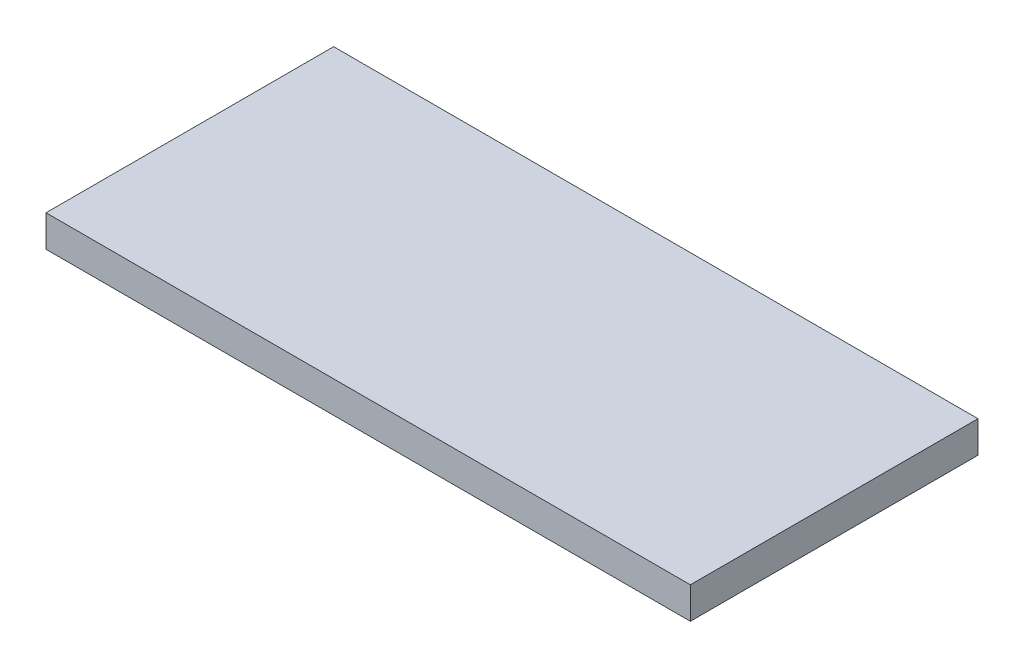
ISO-10303-21;
HEADER;
FILE_DESCRIPTION(('STEP AP214'),'2;1');
FILE_NAME('part.step','',(''),(''),'','','');
FILE_SCHEMA(('AUTOMOTIVE_DESIGN { 1 0 10303 214 1 1 1 1 }'));
ENDSEC;
DATA;
#1=APPLICATION_CONTEXT('core data for automotive mechanical design processes');
#2=APPLICATION_PROTOCOL_DEFINITION('international standard','automotive_design',2000,#1);
#3=PRODUCT_CONTEXT('',#1,'mechanical');
#4=PRODUCT('Part','Part','',(#3));
#5=PRODUCT_RELATED_PRODUCT_CATEGORY('part','',(#4));
#6=PRODUCT_DEFINITION_FORMATION('','',#4);
#7=PRODUCT_DEFINITION_CONTEXT('part definition',#1,'design');
#8=PRODUCT_DEFINITION('design','',#6,#7);
#9=PRODUCT_DEFINITION_SHAPE('','',#8);
#10=(LENGTH_UNIT() NAMED_UNIT(*) SI_UNIT(.MILLI.,.METRE.));
#11=(NAMED_UNIT(*) PLANE_ANGLE_UNIT() SI_UNIT($,.RADIAN.));
#12=(NAMED_UNIT(*) SI_UNIT($,.STERADIAN.) SOLID_ANGLE_UNIT());
#13=UNCERTAINTY_MEASURE_WITH_UNIT(LENGTH_MEASURE(1.E-05),#10,'distance_accuracy_value','');
#14=(GEOMETRIC_REPRESENTATION_CONTEXT(3) GLOBAL_UNCERTAINTY_ASSIGNED_CONTEXT((#13)) GLOBAL_UNIT_ASSIGNED_CONTEXT((#10,
#11,#12)) REPRESENTATION_CONTEXT('',''));
#15=CARTESIAN_POINT('',(0.,0.,0.));
#16=DIRECTION('',(0.,0.,1.));
#17=DIRECTION('',(1.,0.,0.));
#18=AXIS2_PLACEMENT_3D('',#15,#16,#17);
#19=CARTESIAN_POINT('',(142.24,13.97,63.5));
#20=DIRECTION('',(-1.,0.,0.));
#21=DIRECTION('',(0.,0.,1.));
#22=AXIS2_PLACEMENT_3D('',#19,#20,#21);
#23=PLANE('',#22);
#24=DIRECTION('',(0.,0.,-1.));
#25=VECTOR('',#24,1.);
#26=CARTESIAN_POINT('',(142.24,0.,63.5));
#27=LINE('',#26,#25);
#28=CARTESIAN_POINT('',(142.24,0.,63.5));
#29=VERTEX_POINT('',#28);
#30=CARTESIAN_POINT('',(142.24,0.,-63.5));
#31=VERTEX_POINT('',#30);
#32=EDGE_CURVE('E99',#29,#31,#27,.T.);
#33=ORIENTED_EDGE('',*,*,#32,.T.);
#34=DIRECTION('',(0.,-1.,0.));
#35=VECTOR('',#34,1.);
#36=CARTESIAN_POINT('',(142.24,13.97,-63.5));
#37=LINE('',#36,#35);
#38=CARTESIAN_POINT('',(142.24,13.97,-63.5));
#39=VERTEX_POINT('',#38);
#40=EDGE_CURVE('E11',#39,#31,#37,.T.);
#41=ORIENTED_EDGE('',*,*,#40,.F.);
#42=DIRECTION('',(0.,0.,-1.));
#43=VECTOR('',#42,1.);
#44=CARTESIAN_POINT('',(142.24,13.97,63.5));
#45=LINE('',#44,#43);
#46=CARTESIAN_POINT('',(142.24,13.97,63.5));
#47=VERTEX_POINT('',#46);
#48=EDGE_CURVE('E87',#47,#39,#45,.T.);
#49=ORIENTED_EDGE('',*,*,#48,.F.);
#50=DIRECTION('',(0.,-1.,0.));
#51=VECTOR('',#50,1.);
#52=CARTESIAN_POINT('',(142.24,13.97,63.5));
#53=LINE('',#52,#51);
#54=EDGE_CURVE('E95',#47,#29,#53,.T.);
#55=ORIENTED_EDGE('',*,*,#54,.T.);
#56=EDGE_LOOP('',(#33,#41,#49,#55));
#57=FACE_BOUND('',#56,.T.);
#58=ADVANCED_FACE('F36',(#57),#23,.F.);
#59=CARTESIAN_POINT('',(-142.24,13.97,-63.5));
#60=DIRECTION('',(0.,0.,1.));
#61=DIRECTION('',(1.,0.,0.));
#62=AXIS2_PLACEMENT_3D('',#59,#60,#61);
#63=PLANE('',#62);
#64=DIRECTION('',(-1.,0.,0.));
#65=VECTOR('',#64,1.);
#66=CARTESIAN_POINT('',(-142.24,0.,-63.5));
#67=LINE('',#66,#65);
#68=CARTESIAN_POINT('',(-142.24,0.,-63.5));
#69=VERTEX_POINT('',#68);
#70=EDGE_CURVE('E91',#31,#69,#67,.T.);
#71=ORIENTED_EDGE('',*,*,#70,.T.);
#72=DIRECTION('',(0.,-1.,0.));
#73=VECTOR('',#72,1.);
#74=CARTESIAN_POINT('',(-142.24,13.97,-63.5));
#75=LINE('',#74,#73);
#76=CARTESIAN_POINT('',(-142.24,13.97,-63.5));
#77=VERTEX_POINT('',#76);
#78=EDGE_CURVE('E44',#77,#69,#75,.T.);
#79=ORIENTED_EDGE('',*,*,#78,.F.);
#80=DIRECTION('',(-1.,0.,0.));
#81=VECTOR('',#80,1.);
#82=CARTESIAN_POINT('',(-142.24,13.97,-63.5));
#83=LINE('',#82,#81);
#84=EDGE_CURVE('E82',#39,#77,#83,.T.);
#85=ORIENTED_EDGE('',*,*,#84,.F.);
#86=ORIENTED_EDGE('',*,*,#40,.T.);
#87=EDGE_LOOP('',(#71,#79,#85,#86));
#88=FACE_BOUND('',#87,.T.);
#89=ADVANCED_FACE('F90',(#88),#63,.F.);
#90=CARTESIAN_POINT('',(-142.24,13.97,63.5));
#91=DIRECTION('',(1.,0.,0.));
#92=DIRECTION('',(0.,0.,-1.));
#93=AXIS2_PLACEMENT_3D('',#90,#91,#92);
#94=PLANE('',#93);
#95=DIRECTION('',(0.,0.,1.));
#96=VECTOR('',#95,1.);
#97=CARTESIAN_POINT('',(-142.24,0.,63.5));
#98=LINE('',#97,#96);
#99=CARTESIAN_POINT('',(-142.24,0.,63.5));
#100=VERTEX_POINT('',#99);
#101=EDGE_CURVE('E69',#69,#100,#98,.T.);
#102=ORIENTED_EDGE('',*,*,#101,.T.);
#103=DIRECTION('',(0.,-1.,0.));
#104=VECTOR('',#103,1.);
#105=CARTESIAN_POINT('',(-142.24,13.97,63.5));
#106=LINE('',#105,#104);
#107=CARTESIAN_POINT('',(-142.24,13.97,63.5));
#108=VERTEX_POINT('',#107);
#109=EDGE_CURVE('E92',#108,#100,#106,.T.);
#110=ORIENTED_EDGE('',*,*,#109,.F.);
#111=DIRECTION('',(0.,0.,1.));
#112=VECTOR('',#111,1.);
#113=CARTESIAN_POINT('',(-142.24,13.97,63.5));
#114=LINE('',#113,#112);
#115=EDGE_CURVE('E85',#77,#108,#114,.T.);
#116=ORIENTED_EDGE('',*,*,#115,.F.);
#117=ORIENTED_EDGE('',*,*,#78,.T.);
#118=EDGE_LOOP('',(#102,#110,#116,#117));
#119=FACE_BOUND('',#118,.T.);
#120=ADVANCED_FACE('F93',(#119),#94,.F.);
#121=CARTESIAN_POINT('',(-142.24,13.97,63.5));
#122=DIRECTION('',(0.,0.,-1.));
#123=DIRECTION('',(-1.,0.,0.));
#124=AXIS2_PLACEMENT_3D('',#121,#122,#123);
#125=PLANE('',#124);
#126=DIRECTION('',(1.,0.,0.));
#127=VECTOR('',#126,1.);
#128=CARTESIAN_POINT('',(-142.24,0.,63.5));
#129=LINE('',#128,#127);
#130=EDGE_CURVE('E75',#100,#29,#129,.T.);
#131=ORIENTED_EDGE('',*,*,#130,.T.);
#132=ORIENTED_EDGE('',*,*,#54,.F.);
#133=DIRECTION('',(1.,0.,0.));
#134=VECTOR('',#133,1.);
#135=CARTESIAN_POINT('',(-142.24,13.97,63.5));
#136=LINE('',#135,#134);
#137=EDGE_CURVE('E52',#108,#47,#136,.T.);
#138=ORIENTED_EDGE('',*,*,#137,.F.);
#139=ORIENTED_EDGE('',*,*,#109,.T.);
#140=EDGE_LOOP('',(#131,#132,#138,#139));
#141=FACE_BOUND('',#140,.T.);
#142=ADVANCED_FACE('F106',(#141),#125,.F.);
#143=CARTESIAN_POINT('',(0.,13.97,0.));
#144=DIRECTION('',(0.,-1.,0.));
#145=DIRECTION('',(0.,0.,-1.));
#146=AXIS2_PLACEMENT_3D('',#143,#144,#145);
#147=PLANE('',#146);
#148=ORIENTED_EDGE('',*,*,#48,.T.);
#149=ORIENTED_EDGE('',*,*,#84,.T.);
#150=ORIENTED_EDGE('',*,*,#115,.T.);
#151=ORIENTED_EDGE('',*,*,#137,.T.);
#152=EDGE_LOOP('',(#148,#149,#150,#151));
#153=FACE_BOUND('',#152,.T.);
#154=ADVANCED_FACE('F83',(#153),#147,.F.);
#155=CARTESIAN_POINT('',(0.,0.,0.));
#156=DIRECTION('',(0.,-1.,0.));
#157=DIRECTION('',(0.,0.,-1.));
#158=AXIS2_PLACEMENT_3D('',#155,#156,#157);
#159=PLANE('',#158);
#160=ORIENTED_EDGE('',*,*,#32,.F.);
#161=ORIENTED_EDGE('',*,*,#130,.F.);
#162=ORIENTED_EDGE('',*,*,#101,.F.);
#163=ORIENTED_EDGE('',*,*,#70,.F.);
#164=EDGE_LOOP('',(#160,#161,#162,#163));
#165=FACE_BOUND('',#164,.T.);
#166=ADVANCED_FACE('F109',(#165),#159,.T.);
#167=CLOSED_SHELL('',(#58,#89,#120,#142,#154,#166));
#168=MANIFOLD_SOLID_BREP('B2',#167);
#169=ADVANCED_BREP_SHAPE_REPRESENTATION('',(#18,#168),#14);
#170=SHAPE_DEFINITION_REPRESENTATION(#9,#169);
ENDSEC;
END-ISO-10303-21;
